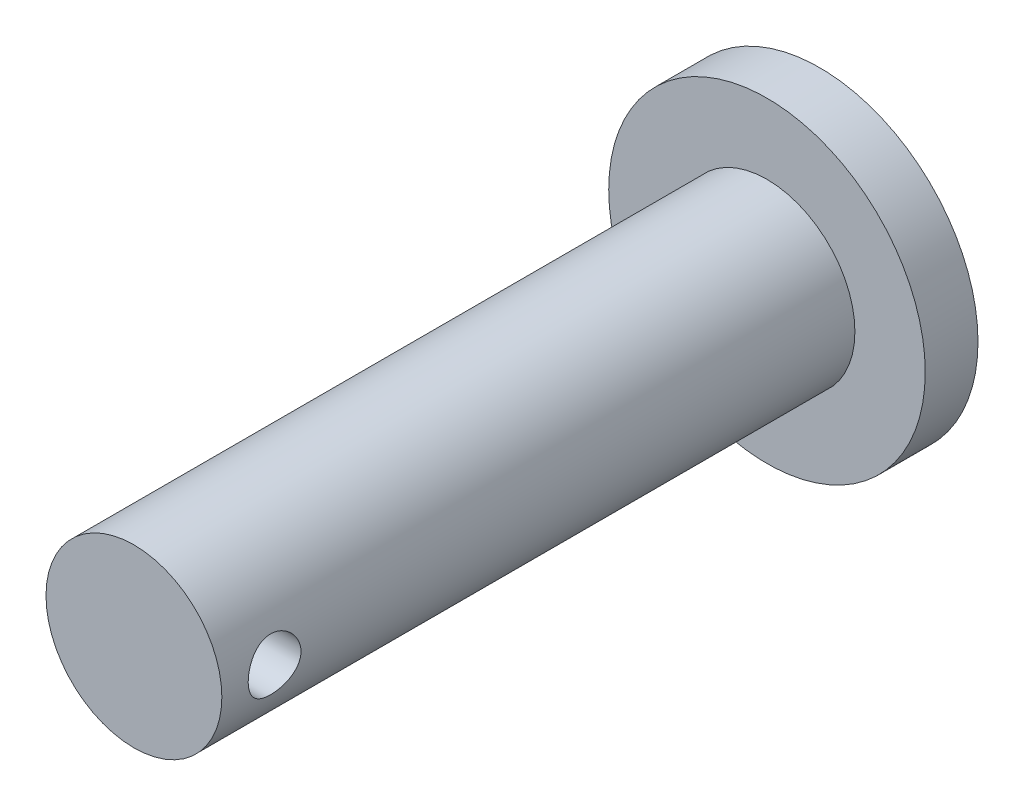
ISO-10303-21;
HEADER;
FILE_DESCRIPTION(('STEP AP214'),'2;1');
FILE_NAME('part.step','',(''),(''),'','','');
FILE_SCHEMA(('AUTOMOTIVE_DESIGN { 1 0 10303 214 1 1 1 1 }'));
ENDSEC;
DATA;
#1=APPLICATION_CONTEXT('core data for automotive mechanical design processes');
#2=APPLICATION_PROTOCOL_DEFINITION('international standard','automotive_design',2000,#1);
#3=PRODUCT_CONTEXT('',#1,'mechanical');
#4=PRODUCT('Part','Part','',(#3));
#5=PRODUCT_RELATED_PRODUCT_CATEGORY('part','',(#4));
#6=PRODUCT_DEFINITION_FORMATION('','',#4);
#7=PRODUCT_DEFINITION_CONTEXT('part definition',#1,'design');
#8=PRODUCT_DEFINITION('design','',#6,#7);
#9=PRODUCT_DEFINITION_SHAPE('','',#8);
#10=(LENGTH_UNIT() NAMED_UNIT(*) SI_UNIT(.MILLI.,.METRE.));
#11=(NAMED_UNIT(*) PLANE_ANGLE_UNIT() SI_UNIT($,.RADIAN.));
#12=(NAMED_UNIT(*) SI_UNIT($,.STERADIAN.) SOLID_ANGLE_UNIT());
#13=UNCERTAINTY_MEASURE_WITH_UNIT(LENGTH_MEASURE(1.E-05),#10,'distance_accuracy_value','');
#14=(GEOMETRIC_REPRESENTATION_CONTEXT(3) GLOBAL_UNCERTAINTY_ASSIGNED_CONTEXT((#13)) GLOBAL_UNIT_ASSIGNED_CONTEXT((#10,
#11,#12)) REPRESENTATION_CONTEXT('',''));
#15=CARTESIAN_POINT('',(0.,0.,0.));
#16=DIRECTION('',(0.,0.,1.));
#17=DIRECTION('',(1.,0.,0.));
#18=AXIS2_PLACEMENT_3D('',#15,#16,#17);
#19=CARTESIAN_POINT('',(0.,0.,36.));
#20=DIRECTION('',(0.,0.,-1.));
#21=DIRECTION('',(-1.,0.,0.));
#22=AXIS2_PLACEMENT_3D('',#19,#20,#21);
#23=CYLINDRICAL_SURFACE('',#22,5.);
#24=CARTESIAN_POINT('',(-5.,0.,34.5));
#25=CARTESIAN_POINT('',(-4.9999992925055,-0.0822886127533004,34.4999990025151));
#26=CARTESIAN_POINT('',(-4.99794915693954,-0.164587318351531,34.493206136376));
#27=CARTESIAN_POINT('',(-4.98997105593691,-0.326788125304882,34.4662786457779));
#28=CARTESIAN_POINT('',(-4.98404193389692,-0.40668950441142,34.4461400419767));
#29=CARTESIAN_POINT('',(-4.96895552501836,-0.561732707754529,34.3932539830897));
#30=CARTESIAN_POINT('',(-4.95980300250425,-0.636881364395377,34.3605251303811));
#31=CARTESIAN_POINT('',(-4.93922109237645,-0.780624181053135,34.2834639069442));
#32=CARTESIAN_POINT('',(-4.92779140192067,-0.849217467469671,34.2391299926046));
#33=CARTESIAN_POINT('',(-4.90350737192774,-0.979871797183747,34.1387759925273));
#34=CARTESIAN_POINT('',(-4.89062383657036,-1.04171807124435,34.0824833741141));
#35=CARTESIAN_POINT('',(-4.86505834210442,-1.15524920923324,33.9603907700898));
#36=CARTESIAN_POINT('',(-4.85237641724501,-1.20693236327441,33.894589187875));
#37=CARTESIAN_POINT('',(-4.82834113993772,-1.29980037723708,33.7535292469624));
#38=CARTESIAN_POINT('',(-4.81702406663875,-1.34072309022214,33.6780915390093));
#39=CARTESIAN_POINT('',(-4.79743620394031,-1.40921394774761,33.5210107457697));
#40=CARTESIAN_POINT('',(-4.78916468313311,-1.43678529919974,33.439369156072));
#41=CARTESIAN_POINT('',(-4.77690870838434,-1.47701633682652,33.2746097338695));
#42=CARTESIAN_POINT('',(-4.77281069324533,-1.49007196234678,33.1915972561361));
#43=CARTESIAN_POINT('',(-4.76902789749767,-1.50213730614672,33.0244668437832));
#44=CARTESIAN_POINT('',(-4.76934204760571,-1.50115042761079,32.9403491819409));
#45=CARTESIAN_POINT('',(-4.77424744067778,-1.48546977199812,32.7766160913915));
#46=CARTESIAN_POINT('',(-4.7786838859914,-1.47127205262686,32.6969477496378));
#47=CARTESIAN_POINT('',(-4.79108356228624,-1.43037420427056,32.5411802137265));
#48=CARTESIAN_POINT('',(-4.7990471413235,-1.40367284141641,32.4650813726257));
#49=CARTESIAN_POINT('',(-4.81772733074973,-1.33816026653682,32.3173996503393));
#50=CARTESIAN_POINT('',(-4.82848016115952,-1.29918816934643,32.2458929160447));
#51=CARTESIAN_POINT('',(-4.85150987000065,-1.21035222588684,32.1102679779898));
#52=CARTESIAN_POINT('',(-4.86378711746991,-1.16048574002589,32.0461515705862));
#53=CARTESIAN_POINT('',(-4.88911011297937,-1.04881290765547,31.924313809238));
#54=CARTESIAN_POINT('',(-4.90216654310498,-0.986594907466975,31.8669713359703));
#55=CARTESIAN_POINT('',(-4.92712244063258,-0.853263259313968,31.7634460159357));
#56=CARTESIAN_POINT('',(-4.9390218351841,-0.782149051860888,31.7172638715856));
#57=CARTESIAN_POINT('',(-4.9604316006947,-0.632355038342802,31.6371400775353));
#58=CARTESIAN_POINT('',(-4.96992543668314,-0.553627749747948,31.6032824837501));
#59=CARTESIAN_POINT('',(-4.98533521832222,-0.391245415603517,31.5494004099004));
#60=CARTESIAN_POINT('',(-4.99125216186999,-0.30759175158958,31.5293720714675));
#61=CARTESIAN_POINT('',(-4.99868364643538,-0.140952242668331,31.5043478221006));
#62=CARTESIAN_POINT('',(-5.0003485041779,-0.0580500976011858,31.4988384141984));
#63=CARTESIAN_POINT('',(-4.9995292324176,0.107499605823384,31.5015691557121));
#64=CARTESIAN_POINT('',(-4.99704565677756,0.190147196690781,31.5098074696514));
#65=CARTESIAN_POINT('',(-4.98830696987163,0.350903605309697,31.5393846111115));
#66=CARTESIAN_POINT('',(-4.98213829799417,0.429072772614171,31.5604233875809));
#67=CARTESIAN_POINT('',(-4.96674347841532,0.580754638954524,31.6146432327782));
#68=CARTESIAN_POINT('',(-4.95751696321085,0.654266777025585,31.6478257610379));
#69=CARTESIAN_POINT('',(-4.93669654351325,0.796437189461055,31.7262531654811));
#70=CARTESIAN_POINT('',(-4.92505280829675,0.864943826199674,31.771759340948));
#71=CARTESIAN_POINT('',(-4.90073468764317,0.993523307980152,31.8732247540528));
#72=CARTESIAN_POINT('',(-4.8880600443108,1.05359403235594,31.9291866118877));
#73=CARTESIAN_POINT('',(-4.86253171869138,1.16585744551027,32.0523873083693));
#74=CARTESIAN_POINT('',(-4.84968825033267,1.21768481231504,32.1199618757717));
#75=CARTESIAN_POINT('',(-4.82576515238463,1.30928995072154,32.2631279390135));
#76=CARTESIAN_POINT('',(-4.81468547654651,1.34906803829472,32.3387192245582));
#77=CARTESIAN_POINT('',(-4.79567189615055,1.41517347127169,32.4955324912547));
#78=CARTESIAN_POINT('',(-4.78772337843827,1.4415634693705,32.5767261865366));
#79=CARTESIAN_POINT('',(-4.77591594362794,1.48021730815114,32.7426879689315));
#80=CARTESIAN_POINT('',(-4.772055625083,1.49248598978779,32.8274548207877));
#81=CARTESIAN_POINT('',(-4.76899972496087,1.50221984485059,32.9943615183762));
#82=CARTESIAN_POINT('',(-4.76961647442754,1.5002805530849,33.0764636510176));
#83=CARTESIAN_POINT('',(-4.77499401288294,1.48307505444814,33.2391141033728));
#84=CARTESIAN_POINT('',(-4.77975463592551,1.46780938124716,33.3196624851764));
#85=CARTESIAN_POINT('',(-4.79275763670385,1.42476888804136,33.4759453991429));
#86=CARTESIAN_POINT('',(-4.80095604545964,1.39715175507069,33.5517272873617));
#87=CARTESIAN_POINT('',(-4.81990278909136,1.3303150712113,33.6976424388177));
#88=CARTESIAN_POINT('',(-4.83065161194312,1.29109329962877,33.7677746176408));
#89=CARTESIAN_POINT('',(-4.85397676425833,1.20048763805073,33.9031631165271));
#90=CARTESIAN_POINT('',(-4.86660540163797,1.14871276092994,33.9681487612604));
#91=CARTESIAN_POINT('',(-4.89201320450026,1.03517434629782,34.0887024983079));
#92=CARTESIAN_POINT('',(-4.90479240823905,0.973408217134502,34.1442681394678));
#93=CARTESIAN_POINT('',(-4.92950936570649,0.839465762183247,34.246023412295));
#94=CARTESIAN_POINT('',(-4.94141159765674,0.767037885790606,34.2918914468555));
#95=CARTESIAN_POINT('',(-4.96260680455813,0.615141373983527,34.370735169904));
#96=CARTESIAN_POINT('',(-4.97190099931067,0.535676052998952,34.4037168882745));
#97=CARTESIAN_POINT('',(-4.98602174969301,0.380757712655279,34.4528952756528));
#98=CARTESIAN_POINT('',(-4.99122027381068,0.305786961954233,34.4705116728832));
#99=CARTESIAN_POINT('',(-4.99820944494492,0.153880195230779,34.4940635252416));
#100=CARTESIAN_POINT('',(-5.0000006615474,0.0769445098581394,34.5000009327048));
#101=CARTESIAN_POINT('',(-5.,0.,34.5));
#102=B_SPLINE_CURVE_WITH_KNOTS('',3,(#24,#25,#26,#27,#28,#29,#30,#31,#32,#33,#34,#35,#36,#37,
#38,#39,#40,#41,#42,#43,#44,#45,#46,#47,#48,#49,#50,#51,#52,#53,#54,#55,#56,#57,#58,#59,#60,#61,
#62,#63,#64,#65,#66,#67,#68,#69,#70,#71,#72,#73,#74,#75,#76,#77,#78,#79,#80,#81,#82,#83,#84,#85,
#86,#87,#88,#89,#90,#91,#92,#93,#94,#95,#96,#97,#98,#99,#100,#101),.UNSPECIFIED.,.T.,.F.,(4,2,2,
2,2,2,2,2,2,2,2,2,2,2,2,2,2,2,2,2,2,2,2,2,2,2,2,2,2,2,2,2,2,2,2,2,2,2,4),(0.,0.246583203612611,
0.493239964846001,0.739533676300879,0.985860164412704,1.23855602948192,1.49129437288634,
1.7497148100411,2.00807314543224,2.259196893566,2.5102597831909,2.75226016697677,
2.99428443658002,3.23962426447121,3.48502360158556,3.74067104048168,3.99633456531073,
4.2537104688169,4.51101453528809,4.75908809438546,5.00712853550328,5.24956746682328,
5.4920355459373,5.7401130570291,5.98825282000193,6.2454040032282,6.50254844252682,
6.75847814951253,7.01432009460284,7.25950155466944,7.50467319661602,7.74680040402723,
7.98897397553109,8.23996925679933,8.49102974897505,8.74942996156673,9.00770911595238,
9.23831691930462,9.46888616948877),.UNSPECIFIED.);
#103=CARTESIAN_POINT('',(-5.,0.,34.5));
#104=VERTEX_POINT('',#103);
#105=EDGE_CURVE('E45',#104,#104,#102,.T.);
#106=ORIENTED_EDGE('',*,*,#105,.T.);
#107=EDGE_LOOP('',(#106));
#108=FACE_BOUND('',#107,.T.);
#109=CARTESIAN_POINT('',(5.,0.,31.5));
#110=CARTESIAN_POINT('',(4.9999992925055,-0.0822886127533005,31.5000009974849));
#111=CARTESIAN_POINT('',(4.99794915693954,-0.164587318351531,31.506793863624));
#112=CARTESIAN_POINT('',(4.98997105593691,-0.326788125304882,31.5337213542221));
#113=CARTESIAN_POINT('',(4.98404193389692,-0.406689504411421,31.5538599580233));
#114=CARTESIAN_POINT('',(4.96895552501836,-0.561732707754528,31.6067460169103));
#115=CARTESIAN_POINT('',(4.95980300250425,-0.636881364395375,31.6394748696189));
#116=CARTESIAN_POINT('',(4.93922109237645,-0.780624181053133,31.7165360930558));
#117=CARTESIAN_POINT('',(4.92779140192067,-0.849217467469671,31.7608700073954));
#118=CARTESIAN_POINT('',(4.90350737192774,-0.979871797183747,31.8612240074727));
#119=CARTESIAN_POINT('',(4.89062383657036,-1.04171807124435,31.9175166258859));
#120=CARTESIAN_POINT('',(4.86505834210442,-1.15524920923324,32.0396092299102));
#121=CARTESIAN_POINT('',(4.85237641724501,-1.20693236327441,32.105410812125));
#122=CARTESIAN_POINT('',(4.82834113993772,-1.29980037723708,32.2464707530376));
#123=CARTESIAN_POINT('',(4.81702406663875,-1.34072309022214,32.3219084609907));
#124=CARTESIAN_POINT('',(4.79743620394031,-1.40921394774761,32.4789892542303));
#125=CARTESIAN_POINT('',(4.78916468313311,-1.43678529919974,32.560630843928));
#126=CARTESIAN_POINT('',(4.77690870838434,-1.47701633682652,32.7253902661305));
#127=CARTESIAN_POINT('',(4.77281069324533,-1.49007196234678,32.808402743864));
#128=CARTESIAN_POINT('',(4.76902789749767,-1.50213730614672,32.9755331562168));
#129=CARTESIAN_POINT('',(4.76934204760571,-1.50115042761079,33.0596508180591));
#130=CARTESIAN_POINT('',(4.77424744067778,-1.48546977199812,33.2233839086085));
#131=CARTESIAN_POINT('',(4.7786838859914,-1.47127205262686,33.3030522503622));
#132=CARTESIAN_POINT('',(4.79108356228624,-1.43037420427056,33.4588197862735));
#133=CARTESIAN_POINT('',(4.7990471413235,-1.40367284141641,33.5349186273743));
#134=CARTESIAN_POINT('',(4.81772733074973,-1.33816026653682,33.6826003496607));
#135=CARTESIAN_POINT('',(4.82848016115952,-1.29918816934643,33.7541070839553));
#136=CARTESIAN_POINT('',(4.85150987000065,-1.21035222588684,33.8897320220102));
#137=CARTESIAN_POINT('',(4.86378711746991,-1.16048574002589,33.9538484294138));
#138=CARTESIAN_POINT('',(4.88911011297937,-1.04881290765547,34.075686190762));
#139=CARTESIAN_POINT('',(4.90216654310498,-0.986594907466975,34.1330286640297));
#140=CARTESIAN_POINT('',(4.92712244063258,-0.853263259313968,34.2365539840643));
#141=CARTESIAN_POINT('',(4.9390218351841,-0.782149051860888,34.2827361284144));
#142=CARTESIAN_POINT('',(4.9604316006947,-0.632355038342802,34.3628599224647));
#143=CARTESIAN_POINT('',(4.96992543668314,-0.553627749747948,34.3967175162499));
#144=CARTESIAN_POINT('',(4.98533521832222,-0.391245415603517,34.4505995900996));
#145=CARTESIAN_POINT('',(4.99125216186999,-0.30759175158958,34.4706279285325));
#146=CARTESIAN_POINT('',(4.99868364643538,-0.140952242668331,34.4956521778994));
#147=CARTESIAN_POINT('',(5.0003485041779,-0.0580500976011858,34.5011615858016));
#148=CARTESIAN_POINT('',(4.9995292324176,0.107499605823384,34.4984308442879));
#149=CARTESIAN_POINT('',(4.99704565677756,0.190147196690781,34.4901925303486));
#150=CARTESIAN_POINT('',(4.98830696987163,0.350903605309697,34.4606153888885));
#151=CARTESIAN_POINT('',(4.98213829799417,0.429072772614171,34.4395766124191));
#152=CARTESIAN_POINT('',(4.96674347841532,0.580754638954524,34.3853567672218));
#153=CARTESIAN_POINT('',(4.95751696321085,0.654266777025585,34.3521742389621));
#154=CARTESIAN_POINT('',(4.93669654351325,0.796437189461055,34.2737468345189));
#155=CARTESIAN_POINT('',(4.92505280829675,0.864943826199674,34.228240659052));
#156=CARTESIAN_POINT('',(4.90073468764317,0.993523307980152,34.1267752459472));
#157=CARTESIAN_POINT('',(4.8880600443108,1.05359403235594,34.0708133881123));
#158=CARTESIAN_POINT('',(4.86253171869138,1.16585744551027,33.9476126916307));
#159=CARTESIAN_POINT('',(4.84968825033267,1.21768481231504,33.8800381242283));
#160=CARTESIAN_POINT('',(4.82576515238463,1.30928995072154,33.7368720609865));
#161=CARTESIAN_POINT('',(4.81468547654651,1.34906803829472,33.6612807754418));
#162=CARTESIAN_POINT('',(4.79567189615055,1.41517347127169,33.5044675087453));
#163=CARTESIAN_POINT('',(4.78772337843827,1.4415634693705,33.4232738134634));
#164=CARTESIAN_POINT('',(4.77591594362794,1.48021730815114,33.2573120310685));
#165=CARTESIAN_POINT('',(4.772055625083,1.49248598978779,33.1725451792123));
#166=CARTESIAN_POINT('',(4.76899972496087,1.50221984485059,33.0056384816238));
#167=CARTESIAN_POINT('',(4.76961647442754,1.5002805530849,32.9235363489824));
#168=CARTESIAN_POINT('',(4.77499401288294,1.48307505444814,32.7608858966272));
#169=CARTESIAN_POINT('',(4.77975463592551,1.46780938124716,32.6803375148236));
#170=CARTESIAN_POINT('',(4.79275763670385,1.42476888804136,32.5240546008572));
#171=CARTESIAN_POINT('',(4.80095604545964,1.39715175507069,32.4482727126383));
#172=CARTESIAN_POINT('',(4.81990278909136,1.3303150712113,32.3023575611823));
#173=CARTESIAN_POINT('',(4.83065161194312,1.29109329962877,32.2322253823592));
#174=CARTESIAN_POINT('',(4.85397676425833,1.20048763805073,32.0968368834729));
#175=CARTESIAN_POINT('',(4.86660540163797,1.14871276092994,32.0318512387396));
#176=CARTESIAN_POINT('',(4.89201320450026,1.03517434629782,31.9112975016921));
#177=CARTESIAN_POINT('',(4.90479240823905,0.973408217134502,31.8557318605322));
#178=CARTESIAN_POINT('',(4.92950936570649,0.839465762183248,31.753976587705));
#179=CARTESIAN_POINT('',(4.94141159765674,0.767037885790608,31.7081085531445));
#180=CARTESIAN_POINT('',(4.96260680455813,0.615141373983529,31.629264830096));
#181=CARTESIAN_POINT('',(4.97190099931066,0.535676052998953,31.5962831117255));
#182=CARTESIAN_POINT('',(4.98602174969301,0.380757712655279,31.5471047243472));
#183=CARTESIAN_POINT('',(4.99122027381068,0.305786961954233,31.5294883271168));
#184=CARTESIAN_POINT('',(4.99820944494492,0.153880195230779,31.5059364747584));
#185=CARTESIAN_POINT('',(5.0000006615474,0.0769445098581394,31.4999990672952));
#186=CARTESIAN_POINT('',(5.,0.,31.5));
#187=B_SPLINE_CURVE_WITH_KNOTS('',3,(#109,#110,#111,#112,#113,#114,#115,#116,#117,#118,#119,
#120,#121,#122,#123,#124,#125,#126,#127,#128,#129,#130,#131,#132,#133,#134,#135,#136,#137,#138,
#139,#140,#141,#142,#143,#144,#145,#146,#147,#148,#149,#150,#151,#152,#153,#154,#155,#156,#157,
#158,#159,#160,#161,#162,#163,#164,#165,#166,#167,#168,#169,#170,#171,#172,#173,#174,#175,#176,
#177,#178,#179,#180,#181,#182,#183,#184,#185,#186),.UNSPECIFIED.,.T.,.F.,(4,2,2,2,2,2,2,2,2,2,2,
2,2,2,2,2,2,2,2,2,2,2,2,2,2,2,2,2,2,2,2,2,2,2,2,2,2,2,4),(0.,0.246583203612611,
0.493239964846001,0.739533676300877,0.985860164412704,1.23855602948192,1.49129437288634,
1.7497148100411,2.00807314543224,2.259196893566,2.5102597831909,2.75226016697677,
2.99428443658002,3.23962426447121,3.48502360158556,3.74067104048168,3.99633456531073,
4.2537104688169,4.51101453528809,4.75908809438546,5.00712853550328,5.24956746682328,
5.4920355459373,5.7401130570291,5.98825282000193,6.2454040032282,6.50254844252682,
6.75847814951253,7.01432009460284,7.25950155466945,7.50467319661602,7.74680040402723,
7.98897397553109,8.23996925679933,8.49102974897505,8.74942996156673,9.00770911595238,
9.23831691930462,9.46888616948877),.UNSPECIFIED.);
#188=CARTESIAN_POINT('',(5.,0.,31.5));
#189=VERTEX_POINT('',#188);
#190=EDGE_CURVE('E65',#189,#189,#187,.T.);
#191=ORIENTED_EDGE('',*,*,#190,.T.);
#192=EDGE_LOOP('',(#191));
#193=FACE_BOUND('',#192,.T.);
#194=CARTESIAN_POINT('',(0.,0.,36.));
#195=DIRECTION('',(0.,0.,1.));
#196=DIRECTION('',(1.,0.,0.));
#197=AXIS2_PLACEMENT_3D('',#194,#195,#196);
#198=CIRCLE('',#197,5.);
#199=CARTESIAN_POINT('',(5.,0.,36.));
#200=VERTEX_POINT('',#199);
#201=EDGE_CURVE('E10',#200,#200,#198,.T.);
#202=ORIENTED_EDGE('',*,*,#201,.F.);
#203=EDGE_LOOP('',(#202));
#204=FACE_BOUND('',#203,.T.);
#205=CARTESIAN_POINT('',(0.,0.,0.));
#206=DIRECTION('',(0.,0.,1.));
#207=DIRECTION('',(1.,0.,0.));
#208=AXIS2_PLACEMENT_3D('',#205,#206,#207);
#209=CIRCLE('',#208,5.);
#210=CARTESIAN_POINT('',(5.,0.,0.));
#211=VERTEX_POINT('',#210);
#212=EDGE_CURVE('E54',#211,#211,#209,.T.);
#213=ORIENTED_EDGE('',*,*,#212,.T.);
#214=EDGE_LOOP('',(#213));
#215=FACE_BOUND('',#214,.T.);
#216=ADVANCED_FACE('F41',(#108,#193,#204,#215),#23,.T.);
#217=CARTESIAN_POINT('',(0.,0.,36.));
#218=DIRECTION('',(0.,0.,1.));
#219=DIRECTION('',(1.,0.,0.));
#220=AXIS2_PLACEMENT_3D('',#217,#218,#219);
#221=PLANE('',#220);
#222=ORIENTED_EDGE('',*,*,#201,.T.);
#223=EDGE_LOOP('',(#222));
#224=FACE_BOUND('',#223,.T.);
#225=ADVANCED_FACE('F87',(#224),#221,.T.);
#226=CARTESIAN_POINT('',(0.,0.,-3.));
#227=DIRECTION('',(0.,0.,1.));
#228=DIRECTION('',(1.,0.,0.));
#229=AXIS2_PLACEMENT_3D('',#226,#227,#228);
#230=CYLINDRICAL_SURFACE('',#229,9.);
#231=CARTESIAN_POINT('',(0.,0.,-3.));
#232=DIRECTION('',(0.,0.,1.));
#233=DIRECTION('',(1.,0.,0.));
#234=AXIS2_PLACEMENT_3D('',#231,#232,#233);
#235=CIRCLE('',#234,9.);
#236=CARTESIAN_POINT('',(9.,0.,-3.));
#237=VERTEX_POINT('',#236);
#238=EDGE_CURVE('E60',#237,#237,#235,.T.);
#239=ORIENTED_EDGE('',*,*,#238,.T.);
#240=EDGE_LOOP('',(#239));
#241=FACE_BOUND('',#240,.T.);
#242=CARTESIAN_POINT('',(0.,0.,0.));
#243=DIRECTION('',(0.,0.,1.));
#244=DIRECTION('',(1.,0.,0.));
#245=AXIS2_PLACEMENT_3D('',#242,#243,#244);
#246=CIRCLE('',#245,9.);
#247=CARTESIAN_POINT('',(9.,0.,0.));
#248=VERTEX_POINT('',#247);
#249=EDGE_CURVE('E63',#248,#248,#246,.T.);
#250=ORIENTED_EDGE('',*,*,#249,.F.);
#251=EDGE_LOOP('',(#250));
#252=FACE_BOUND('',#251,.T.);
#253=ADVANCED_FACE('F81',(#241,#252),#230,.T.);
#254=CARTESIAN_POINT('',(0.,0.,-3.));
#255=DIRECTION('',(0.,0.,1.));
#256=DIRECTION('',(1.,0.,0.));
#257=AXIS2_PLACEMENT_3D('',#254,#255,#256);
#258=PLANE('',#257);
#259=ORIENTED_EDGE('',*,*,#238,.F.);
#260=EDGE_LOOP('',(#259));
#261=FACE_BOUND('',#260,.T.);
#262=ADVANCED_FACE('F77',(#261),#258,.F.);
#263=CARTESIAN_POINT('',(0.,0.,0.));
#264=DIRECTION('',(0.,0.,1.));
#265=DIRECTION('',(1.,0.,0.));
#266=AXIS2_PLACEMENT_3D('',#263,#264,#265);
#267=PLANE('',#266);
#268=ORIENTED_EDGE('',*,*,#212,.F.);
#269=EDGE_LOOP('',(#268));
#270=FACE_BOUND('',#269,.T.);
#271=ORIENTED_EDGE('',*,*,#249,.T.);
#272=EDGE_LOOP('',(#271));
#273=FACE_BOUND('',#272,.T.);
#274=ADVANCED_FACE('F75',(#270,#273),#267,.T.);
#275=CARTESIAN_POINT('',(-9.,0.,33.));
#276=DIRECTION('',(1.,0.,0.));
#277=DIRECTION('',(0.,0.,-1.));
#278=AXIS2_PLACEMENT_3D('',#275,#276,#277);
#279=CYLINDRICAL_SURFACE('',#278,1.5);
#280=ORIENTED_EDGE('',*,*,#190,.F.);
#281=EDGE_LOOP('',(#280));
#282=FACE_BOUND('',#281,.T.);
#283=ORIENTED_EDGE('',*,*,#105,.F.);
#284=EDGE_LOOP('',(#283));
#285=FACE_BOUND('',#284,.T.);
#286=ADVANCED_FACE('F71',(#282,#285),#279,.F.);
#287=CLOSED_SHELL('',(#216,#225,#253,#262,#274,#286));
#288=MANIFOLD_SOLID_BREP('B2',#287);
#289=ADVANCED_BREP_SHAPE_REPRESENTATION('',(#18,#288),#14);
#290=SHAPE_DEFINITION_REPRESENTATION(#9,#289);
ENDSEC;
END-ISO-10303-21;
